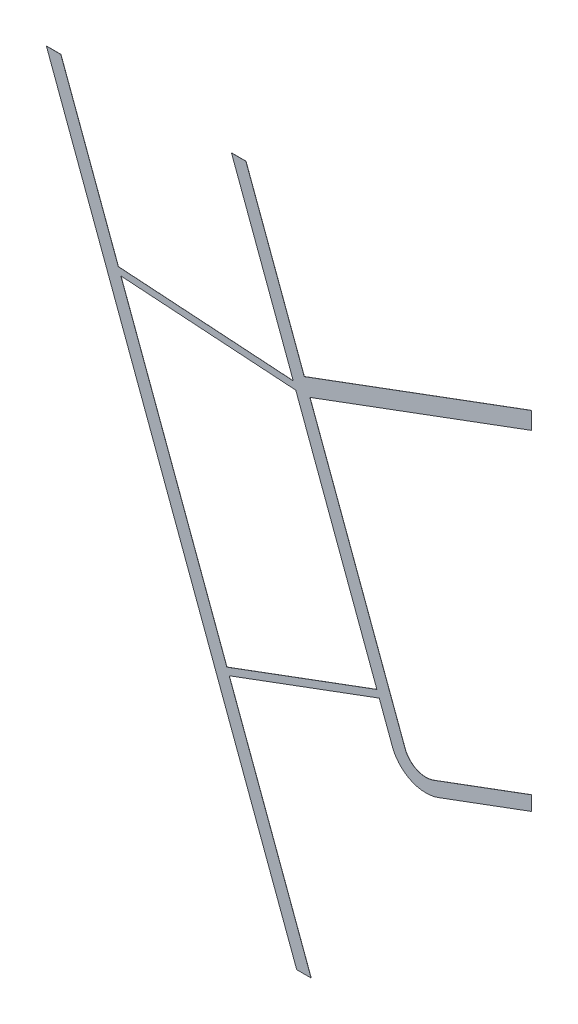
ISO-10303-21;
HEADER;
FILE_DESCRIPTION(('STEP AP214'),'2;1');
FILE_NAME('part.step','',(''),(''),'','','');
FILE_SCHEMA(('AUTOMOTIVE_DESIGN { 1 0 10303 214 1 1 1 1 }'));
ENDSEC;
DATA;
#1=APPLICATION_CONTEXT('core data for automotive mechanical design processes');
#2=APPLICATION_PROTOCOL_DEFINITION('international standard','automotive_design',2000,#1);
#3=PRODUCT_CONTEXT('',#1,'mechanical');
#4=PRODUCT('Part','Part','',(#3));
#5=PRODUCT_RELATED_PRODUCT_CATEGORY('part','',(#4));
#6=PRODUCT_DEFINITION_FORMATION('','',#4);
#7=PRODUCT_DEFINITION_CONTEXT('part definition',#1,'design');
#8=PRODUCT_DEFINITION('design','',#6,#7);
#9=PRODUCT_DEFINITION_SHAPE('','',#8);
#10=(LENGTH_UNIT() NAMED_UNIT(*) SI_UNIT(.MILLI.,.METRE.));
#11=(NAMED_UNIT(*) PLANE_ANGLE_UNIT() SI_UNIT($,.RADIAN.));
#12=(NAMED_UNIT(*) SI_UNIT($,.STERADIAN.) SOLID_ANGLE_UNIT());
#13=UNCERTAINTY_MEASURE_WITH_UNIT(LENGTH_MEASURE(1.E-05),#10,'distance_accuracy_value','');
#14=(GEOMETRIC_REPRESENTATION_CONTEXT(3) GLOBAL_UNCERTAINTY_ASSIGNED_CONTEXT((#13)) GLOBAL_UNIT_ASSIGNED_CONTEXT((#10,
#11,#12)) REPRESENTATION_CONTEXT('',''));
#15=CARTESIAN_POINT('',(0.,0.,0.));
#16=DIRECTION('',(0.,0.,1.));
#17=DIRECTION('',(1.,0.,0.));
#18=AXIS2_PLACEMENT_3D('',#15,#16,#17);
#19=CARTESIAN_POINT('',(105886.022376509,39280.2986235443,0.));
#20=DIRECTION('',(-0.937423422533661,-0.347753850294752,0.0174524064372835));
#21=DIRECTION('',(0.347806822958529,-0.937566218409929,0.));
#22=AXIS2_PLACEMENT_3D('',#19,#20,#21);
#23=PLANE('',#22);
#24=DIRECTION('',(-0.347806822958529,0.937566218409929,0.));
#25=VECTOR('',#24,1.);
#26=CARTESIAN_POINT('',(105886.022376509,39280.2986235443,0.));
#27=LINE('',#26,#25);
#28=CARTESIAN_POINT('',(135462.997839648,-40448.9395814397,0.));
#29=VERTEX_POINT('',#28);
#30=CARTESIAN_POINT('',(75362.2991137215,121561.639592795,0.));
#31=VERTEX_POINT('',#30);
#32=EDGE_CURVE('E272',#29,#31,#27,.T.);
#33=ORIENTED_EDGE('',*,*,#32,.F.);
#34=DIRECTION('',(-0.0224294371497834,0.0102911535157828,-0.999695459881888));
#35=VECTOR('',#34,1.);
#36=CARTESIAN_POINT('',(135429.714781213,-40433.6685310986,-1483.44883498776));
#37=LINE('',#36,#35);
#38=CARTESIAN_POINT('',(135465.241466638,-40449.9690102937,100.));
#39=VERTEX_POINT('',#38);
#40=EDGE_CURVE('E11',#39,#29,#37,.T.);
#41=ORIENTED_EDGE('',*,*,#40,.F.);
#42=DIRECTION('',(-0.347806822958529,0.937566218409929,0.));
#43=VECTOR('',#42,1.);
#44=CARTESIAN_POINT('',(105887.65890443,39280.905722612,100.));
#45=LINE('',#44,#43);
#46=CARTESIAN_POINT('',(75363.5422398978,121563.307166133,100.));
#47=VERTEX_POINT('',#46);
#48=EDGE_CURVE('E371',#39,#47,#45,.T.);
#49=ORIENTED_EDGE('',*,*,#48,.T.);
#50=DIRECTION('',(-0.012428573650737,-0.0166721274536834,-0.999783761982148));
#51=VECTOR('',#50,1.);
#52=CARTESIAN_POINT('',(75352.8503053564,121548.964627688,-760.084418298319));
#53=LINE('',#52,#51);
#54=EDGE_CURVE('E51',#47,#31,#53,.T.);
#55=ORIENTED_EDGE('',*,*,#54,.T.);
#56=EDGE_LOOP('',(#33,#41,#49,#55));
#57=FACE_BOUND('',#56,.T.);
#58=ADVANCED_FACE('F34',(#57),#23,.T.);
#59=CARTESIAN_POINT('',(29576.9754631399,-79729.2382049841,0.));
#60=DIRECTION('',(-0.347753850294752,0.937423422533661,0.0174524064372835));
#61=DIRECTION('',(-0.937566218409929,-0.347806822958529,0.));
#62=AXIS2_PLACEMENT_3D('',#59,#60,#61);
#63=PLANE('',#62);
#64=DIRECTION('',(0.937566218409929,0.347806822958529,0.));
#65=VECTOR('',#64,1.);
#66=CARTESIAN_POINT('',(29576.9754631399,-79729.2382049841,0.));
#67=LINE('',#66,#65);
#68=CARTESIAN_POINT('',(24270.0392753806,-81697.9403391529,0.));
#69=VERTEX_POINT('',#68);
#70=EDGE_CURVE('E275',#69,#29,#67,.T.);
#71=ORIENTED_EDGE('',*,*,#70,.F.);
#72=DIRECTION('',(-0.0102911535157828,-0.0224294371497834,0.999695459881888));
#73=VECTOR('',#72,1.);
#74=CARTESIAN_POINT('',(24285.3103257218,-81664.657280717,-1483.44883498776));
#75=LINE('',#74,#73);
#76=CARTESIAN_POINT('',(24269.0098465267,-81700.1839661423,100.));
#77=VERTEX_POINT('',#76);
#78=EDGE_CURVE('E43',#77,#69,#75,.F.);
#79=ORIENTED_EDGE('',*,*,#78,.F.);
#80=DIRECTION('',(0.937566218409929,0.347806822958529,0.));
#81=VECTOR('',#80,1.);
#82=CARTESIAN_POINT('',(29577.5825622076,-79730.8747329058,100.));
#83=LINE('',#82,#81);
#84=EDGE_CURVE('E378',#77,#39,#83,.T.);
#85=ORIENTED_EDGE('',*,*,#84,.T.);
#86=ORIENTED_EDGE('',*,*,#40,.T.);
#87=EDGE_LOOP('',(#71,#79,#85,#86));
#88=FACE_BOUND('',#87,.T.);
#89=ADVANCED_FACE('F36',(#88),#63,.T.);
#90=CARTESIAN_POINT('',(-5306.93618775923,-1968.70213416878,0.));
#91=DIRECTION('',(0.937423422533661,0.347753850294752,0.0174524064372835));
#92=DIRECTION('',(-0.347806822958529,0.937566218409929,0.));
#93=AXIS2_PLACEMENT_3D('',#90,#91,#92);
#94=PLANE('',#93);
#95=DIRECTION('',(-0.347806822958529,0.937566218409929,0.));
#96=VECTOR('',#95,1.);
#97=CARTESIAN_POINT('',(-5306.93618775923,-1968.70213416878,0.));
#98=LINE('',#97,#96);
#99=CARTESIAN_POINT('',(-54293.7378771381,130082.67633285,0.));
#100=VERTEX_POINT('',#99);
#101=EDGE_CURVE('E278',#69,#100,#98,.T.);
#102=ORIENTED_EDGE('',*,*,#101,.T.);
#103=DIRECTION('',(-0.0257208088566021,0.0191740956946787,0.999485264546733));
#104=VECTOR('',#103,1.);
#105=CARTESIAN_POINT('',(-54250.3143081011,130050.305357553,-1687.39706548793));
#106=LINE('',#105,#104);
#107=CARTESIAN_POINT('',(-54296.3112826469,130084.594729886,100.));
#108=VERTEX_POINT('',#107);
#109=EDGE_CURVE('E374',#108,#100,#106,.F.);
#110=ORIENTED_EDGE('',*,*,#109,.F.);
#111=DIRECTION('',(0.347806822958529,-0.937566218409929,0.));
#112=VECTOR('',#111,1.);
#113=CARTESIAN_POINT('',(-5308.57271568091,-1969.30923323651,100.));
#114=LINE('',#113,#112);
#115=EDGE_CURVE('E59',#77,#108,#114,.F.);
#116=ORIENTED_EDGE('',*,*,#115,.F.);
#117=ORIENTED_EDGE('',*,*,#78,.T.);
#118=EDGE_LOOP('',(#102,#110,#116,#117));
#119=FACE_BOUND('',#118,.T.);
#120=ADVANCED_FACE('F389',(#119),#94,.T.);
#121=CARTESIAN_POINT('',(171789.188269937,-62216.0640065166,0.));
#122=DIRECTION('',(0.,0.,1.));
#123=DIRECTION('',(1.,0.,0.));
#124=AXIS2_PLACEMENT_3D('',#121,#122,#123);
#125=CONICAL_SURFACE('',#124,16487.4545997351,0.0174532925199433);
#126=CARTESIAN_POINT('',(171789.188269937,-62216.0640065166,0.));
#127=DIRECTION('',(0.,0.,1.));
#128=DIRECTION('',(1.,0.,0.));
#129=AXIS2_PLACEMENT_3D('',#126,#127,#128);
#130=CIRCLE('',#129,16487.4545997351);
#131=CARTESIAN_POINT('',(156331.107809658,-67950.5132095235,0.));
#132=VERTEX_POINT('',#131);
#133=CARTESIAN_POINT('',(177523.637472943,-77674.1444667957,0.));
#134=VERTEX_POINT('',#133);
#135=EDGE_CURVE('E217',#132,#134,#130,.T.);
#136=ORIENTED_EDGE('',*,*,#135,.F.);
#137=DIRECTION('',(0.016362786705557,0.00607006603593257,-0.999847695156391));
#138=VECTOR('',#137,1.);
#139=CARTESIAN_POINT('',(156331.107809658,-67950.5132095235,-1.23969035357567E-13));
#140=LINE('',#139,#138);
#141=CARTESIAN_POINT('',(156329.471281736,-67951.1203085913,100.));
#142=VERTEX_POINT('',#141);
#143=EDGE_CURVE('E198',#142,#132,#140,.T.);
#144=ORIENTED_EDGE('',*,*,#143,.F.);
#145=CARTESIAN_POINT('',(171789.188269937,-62216.0640065166,100.));
#146=DIRECTION('',(0.,0.,1.));
#147=DIRECTION('',(1.,0.,0.));
#148=AXIS2_PLACEMENT_3D('',#145,#146,#147);
#149=CIRCLE('',#148,16489.200106228);
#150=CARTESIAN_POINT('',(177524.244572011,-77675.7809947174,100.));
#151=VERTEX_POINT('',#150);
#152=EDGE_CURVE('E283',#142,#151,#149,.T.);
#153=ORIENTED_EDGE('',*,*,#152,.T.);
#154=DIRECTION('',(-0.00607006603593255,0.016362786705557,-0.999847695156391));
#155=VECTOR('',#154,1.);
#156=CARTESIAN_POINT('',(177523.637472943,-77674.1444667957,-1.85981878977343E-13));
#157=LINE('',#156,#155);
#158=EDGE_CURVE('E223',#151,#134,#157,.T.);
#159=ORIENTED_EDGE('',*,*,#158,.T.);
#160=EDGE_LOOP('',(#136,#144,#153,#159));
#161=FACE_BOUND('',#160,.T.);
#162=ADVANCED_FACE('F222',(#161),#125,.F.);
#163=CARTESIAN_POINT('',(115261.684560608,42758.3668531296,0.));
#164=DIRECTION('',(0.937423422533661,0.347753850294752,0.0174524064372835));
#165=DIRECTION('',(-0.347806822958529,0.937566218409929,0.));
#166=AXIS2_PLACEMENT_3D('',#163,#164,#165);
#167=PLANE('',#166);
#168=DIRECTION('',(-0.347806822958529,0.937566218409929,0.));
#169=VECTOR('',#168,1.);
#170=CARTESIAN_POINT('',(115261.684560608,42758.3668531296,0.));
#171=LINE('',#170,#169);
#172=CARTESIAN_POINT('',(85803.0786017647,122168.522046532,0.));
#173=VERTEX_POINT('',#172);
#174=EDGE_CURVE('E202',#132,#173,#171,.T.);
#175=ORIENTED_EDGE('',*,*,#174,.T.);
#176=DIRECTION('',(0.0224294371497834,-0.0102911535157828,-0.999695459881888));
#177=VECTOR('',#176,1.);
#178=CARTESIAN_POINT('',(85836.2284586453,122153.312112198,-1477.51194994468));
#179=LINE('',#178,#177);
#180=CARTESIAN_POINT('',(85800.8349747753,122169.551475386,100.));
#181=VERTEX_POINT('',#180);
#182=EDGE_CURVE('E209',#181,#173,#179,.T.);
#183=ORIENTED_EDGE('',*,*,#182,.F.);
#184=DIRECTION('',(0.347806822958529,-0.937566218409929,0.));
#185=VECTOR('',#184,1.);
#186=CARTESIAN_POINT('',(115260.048032686,42757.7597540619,100.));
#187=LINE('',#186,#185);
#188=EDGE_CURVE('E204',#142,#181,#187,.F.);
#189=ORIENTED_EDGE('',*,*,#188,.F.);
#190=ORIENTED_EDGE('',*,*,#143,.T.);
#191=EDGE_LOOP('',(#175,#183,#189,#190));
#192=FACE_BOUND('',#191,.T.);
#193=ADVANCED_FACE('F200',(#192),#167,.T.);
#194=CARTESIAN_POINT('',(-29458.6059588433,79410.1551934018,0.));
#195=DIRECTION('',(0.347753850294754,-0.937423422533661,0.0174524064372835));
#196=DIRECTION('',(0.937566218409928,0.347806822958531,0.));
#197=AXIS2_PLACEMENT_3D('',#194,#195,#196);
#198=PLANE('',#197);
#199=DIRECTION('',(0.937566218409928,0.347806822958531,0.));
#200=VECTOR('',#199,1.);
#201=CARTESIAN_POINT('',(-29458.6059588433,79410.1551934018,0.));
#202=LINE('',#201,#200);
#203=CARTESIAN_POINT('',(250000.,183080.283210395,0.));
#204=VERTEX_POINT('',#203);
#205=EDGE_CURVE('E220',#173,#204,#202,.T.);
#206=ORIENTED_EDGE('',*,*,#205,.T.);
#207=DIRECTION('',(0.0174511204503486,-0.0121394110260807,-0.999774021014233));
#208=VECTOR('',#207,1.);
#209=CARTESIAN_POINT('',(250038.784884997,183053.303529524,-2221.98457334734));
#210=LINE('',#209,#208);
#211=CARTESIAN_POINT('',(249998.254493507,183081.497425885,100.));
#212=VERTEX_POINT('',#211);
#213=EDGE_CURVE('E323',#212,#204,#210,.T.);
#214=ORIENTED_EDGE('',*,*,#213,.F.);
#215=DIRECTION('',(-0.937566218409928,-0.347806822958531,0.));
#216=VECTOR('',#215,1.);
#217=CARTESIAN_POINT('',(-29459.2130579111,79411.7917213235,100.));
#218=LINE('',#217,#216);
#219=EDGE_CURVE('E329',#181,#212,#218,.F.);
#220=ORIENTED_EDGE('',*,*,#219,.F.);
#221=ORIENTED_EDGE('',*,*,#182,.T.);
#222=EDGE_LOOP('',(#206,#214,#220,#221));
#223=FACE_BOUND('',#222,.T.);
#224=ADVANCED_FACE('F408',(#223),#198,.T.);
#225=CARTESIAN_POINT('',(249999.999999999,-1.1103014429754E-09,0.));
#226=DIRECTION('',(0.999847695156391,0.,0.0174524064372835));
#227=DIRECTION('',(0.0174524064372835,0.,-0.999847695156391));
#228=AXIS2_PLACEMENT_3D('',#225,#226,#227);
#229=PLANE('',#228);
#230=DIRECTION('',(0.,1.,0.));
#231=VECTOR('',#230,1.);
#232=CARTESIAN_POINT('',(249999.999999999,-1.1103014429754E-09,0.));
#233=LINE('',#232,#231);
#234=CARTESIAN_POINT('',(250000.,195879.379172226,0.));
#235=VERTEX_POINT('',#234);
#236=EDGE_CURVE('E227',#204,#235,#233,.T.);
#237=ORIENTED_EDGE('',*,*,#236,.T.);
#238=DIRECTION('',(-0.0174469163102588,-0.0250809728217744,0.999533165989792));
#239=VECTOR('',#238,1.);
#240=CARTESIAN_POINT('',(249914.285997716,195756.160230638,4910.5519020519));
#241=LINE('',#240,#239);
#242=CARTESIAN_POINT('',(249998.254493507,195876.869903532,100.));
#243=VERTEX_POINT('',#242);
#244=EDGE_CURVE('E321',#243,#235,#241,.F.);
#245=ORIENTED_EDGE('',*,*,#244,.F.);
#246=DIRECTION('',(0.,-1.,0.));
#247=VECTOR('',#246,1.);
#248=CARTESIAN_POINT('',(249998.254493506,-1.11029369082189E-09,100.));
#249=LINE('',#248,#247);
#250=EDGE_CURVE('E331',#212,#243,#249,.F.);
#251=ORIENTED_EDGE('',*,*,#250,.F.);
#252=ORIENTED_EDGE('',*,*,#213,.T.);
#253=EDGE_LOOP('',(#237,#245,#251,#252));
#254=FACE_BOUND('',#253,.T.);
#255=ADVANCED_FACE('F474',(#254),#229,.T.);
#256=CARTESIAN_POINT('',(-33632.2878343457,90660.9498143214,0.));
#257=DIRECTION('',(-0.347753850294752,0.937423422533661,0.0174524064372835));
#258=DIRECTION('',(-0.937566218409929,-0.347806822958529,0.));
#259=AXIS2_PLACEMENT_3D('',#256,#257,#258);
#260=PLANE('',#259);
#261=DIRECTION('',(0.937566218409929,0.347806822958529,0.));
#262=VECTOR('',#261,1.);
#263=CARTESIAN_POINT('',(-33632.2878343457,90660.9498143214,0.));
#264=LINE('',#263,#262);
#265=CARTESIAN_POINT('',(81629.3967262622,133419.316667451,0.));
#266=VERTEX_POINT('',#265);
#267=EDGE_CURVE('E230',#266,#235,#264,.T.);
#268=ORIENTED_EDGE('',*,*,#267,.F.);
#269=DIRECTION('',(-0.0102911535157828,-0.0224294371497834,0.999695459881888));
#270=VECTOR('',#269,1.);
#271=CARTESIAN_POINT('',(81612.0318553596,133381.470153945,1686.84517008883));
#272=LINE('',#271,#270);
#273=CARTESIAN_POINT('',(81628.3672974083,133417.073040462,100.));
#274=VERTEX_POINT('',#273);
#275=EDGE_CURVE('E319',#274,#266,#272,.F.);
#276=ORIENTED_EDGE('',*,*,#275,.F.);
#277=DIRECTION('',(0.937566218409929,0.347806822958529,0.));
#278=VECTOR('',#277,1.);
#279=CARTESIAN_POINT('',(-33631.680735278,90659.3132863997,100.));
#280=LINE('',#279,#278);
#281=EDGE_CURVE('E333',#274,#243,#280,.T.);
#282=ORIENTED_EDGE('',*,*,#281,.T.);
#283=ORIENTED_EDGE('',*,*,#244,.T.);
#284=EDGE_LOOP('',(#268,#276,#282,#283));
#285=FACE_BOUND('',#284,.T.);
#286=ADVANCED_FACE('F470',(#285),#260,.T.);
#287=CARTESIAN_POINT('',(115261.684560608,42758.3668531296,0.));
#288=DIRECTION('',(0.937423422533661,0.347753850294752,0.0174524064372835));
#289=DIRECTION('',(-0.347806822958529,0.937566218409929,0.));
#290=AXIS2_PLACEMENT_3D('',#287,#288,#289);
#291=PLANE('',#290);
#292=DIRECTION('',(-0.347806822958529,0.937566218409929,0.));
#293=VECTOR('',#292,1.);
#294=CARTESIAN_POINT('',(115261.684560608,42758.3668531296,0.));
#295=LINE('',#294,#293);
#296=CARTESIAN_POINT('',(38381.7238770899,250000.,0.));
#297=VERTEX_POINT('',#296);
#298=EDGE_CURVE('E233',#266,#297,#295,.T.);
#299=ORIENTED_EDGE('',*,*,#298,.T.);
#300=DIRECTION('',(-0.0121394110260807,-0.0174511204503486,0.999774021014233));
#301=VECTOR('',#300,1.);
#302=CARTESIAN_POINT('',(38349.1499374002,249953.173037485,2682.71488575004));
#303=LINE('',#302,#301);
#304=CARTESIAN_POINT('',(38380.5096616002,249998.254493507,100.));
#305=VERTEX_POINT('',#304);
#306=EDGE_CURVE('E317',#305,#297,#303,.F.);
#307=ORIENTED_EDGE('',*,*,#306,.F.);
#308=DIRECTION('',(0.347806822958529,-0.937566218409929,0.));
#309=VECTOR('',#308,1.);
#310=CARTESIAN_POINT('',(115260.048032686,42757.7597540619,100.));
#311=LINE('',#310,#309);
#312=EDGE_CURVE('E336',#274,#305,#311,.F.);
#313=ORIENTED_EDGE('',*,*,#312,.F.);
#314=ORIENTED_EDGE('',*,*,#275,.T.);
#315=EDGE_LOOP('',(#299,#307,#313,#314));
#316=FACE_BOUND('',#315,.T.);
#317=ADVANCED_FACE('F466',(#316),#291,.T.);
#318=CARTESIAN_POINT('',(0.,250000.,0.));
#319=DIRECTION('',(0.,0.999847695156391,0.0174524064372835));
#320=DIRECTION('',(0.,-0.0174524064372835,0.999847695156391));
#321=AXIS2_PLACEMENT_3D('',#318,#319,#320);
#322=PLANE('',#321);
#323=DIRECTION('',(1.,0.,0.));
#324=VECTOR('',#323,1.);
#325=CARTESIAN_POINT('',(0.,250000.,0.));
#326=LINE('',#325,#324);
#327=CARTESIAN_POINT('',(27715.8105755638,250000.,0.));
#328=VERTEX_POINT('',#327);
#329=EDGE_CURVE('E236',#328,#297,#326,.T.);
#330=ORIENTED_EDGE('',*,*,#329,.F.);
#331=DIRECTION('',(-0.0250809728217743,0.0174469163102587,-0.999533165989792));
#332=VECTOR('',#331,1.);
#333=CARTESIAN_POINT('',(27857.1918676827,249901.65183827,5634.36241199722));
#334=LINE('',#333,#332);
#335=CARTESIAN_POINT('',(27718.319844258,249998.254493507,100.));
#336=VERTEX_POINT('',#335);
#337=EDGE_CURVE('E315',#336,#328,#334,.T.);
#338=ORIENTED_EDGE('',*,*,#337,.F.);
#339=DIRECTION('',(1.,0.,0.));
#340=VECTOR('',#339,1.);
#341=CARTESIAN_POINT('',(0.,249998.254493507,100.));
#342=LINE('',#341,#340);
#343=EDGE_CURVE('E338',#336,#305,#342,.T.);
#344=ORIENTED_EDGE('',*,*,#343,.T.);
#345=ORIENTED_EDGE('',*,*,#306,.T.);
#346=EDGE_LOOP('',(#330,#338,#344,#345));
#347=FACE_BOUND('',#346,.T.);
#348=ADVANCED_FACE('F462',(#347),#322,.T.);
#349=CARTESIAN_POINT('',(105886.022376509,39280.2986235443,0.));
#350=DIRECTION('',(-0.937423422533661,-0.347753850294752,0.0174524064372835));
#351=DIRECTION('',(0.347806822958529,-0.937566218409929,0.));
#352=AXIS2_PLACEMENT_3D('',#349,#350,#351);
#353=PLANE('',#352);
#354=DIRECTION('',(-0.347806822958529,0.937566218409929,0.));
#355=VECTOR('',#354,1.);
#356=CARTESIAN_POINT('',(105886.022376509,39280.2986235443,0.));
#357=LINE('',#356,#355);
#358=CARTESIAN_POINT('',(73507.4604040441,126561.639592795,0.));
#359=VERTEX_POINT('',#358);
#360=EDGE_CURVE('E239',#359,#328,#357,.T.);
#361=ORIENTED_EDGE('',*,*,#360,.F.);
#362=DIRECTION('',(0.0257208088566021,-0.0191740956946787,0.999485264546733));
#363=VECTOR('',#362,1.);
#364=CARTESIAN_POINT('',(73462.4151057434,126595.219518878,-1750.41586520992));
#365=LINE('',#364,#363);
#366=CARTESIAN_POINT('',(73510.0338095528,126559.721195758,100.));
#367=VERTEX_POINT('',#366);
#368=EDGE_CURVE('E313',#367,#359,#365,.F.);
#369=ORIENTED_EDGE('',*,*,#368,.F.);
#370=DIRECTION('',(-0.347806822958529,0.937566218409929,0.));
#371=VECTOR('',#370,1.);
#372=CARTESIAN_POINT('',(105887.65890443,39280.9057226121,100.));
#373=LINE('',#372,#371);
#374=EDGE_CURVE('E341',#367,#336,#373,.T.);
#375=ORIENTED_EDGE('',*,*,#374,.T.);
#376=ORIENTED_EDGE('',*,*,#337,.T.);
#377=EDGE_LOOP('',(#361,#369,#375,#376));
#378=FACE_BOUND('',#377,.T.);
#379=ADVANCED_FACE('F458',(#378),#353,.T.);
#380=CARTESIAN_POINT('',(8598.02623537787,130827.508627234,0.));
#381=DIRECTION('',(0.0655688656533903,0.997695413122901,0.0174524064372835));
#382=DIRECTION('',(-0.997847390113597,0.0655788536304365,0.));
#383=AXIS2_PLACEMENT_3D('',#380,#381,#382);
#384=PLANE('',#383);
#385=DIRECTION('',(-0.997847390113597,0.0655788536304366,0.));
#386=VECTOR('',#385,1.);
#387=CARTESIAN_POINT('',(8598.02623537787,130827.508627234,0.));
#388=LINE('',#387,#386);
#389=CARTESIAN_POINT('',(-56148.5765868156,135082.67633285,0.));
#390=VERTEX_POINT('',#389);
#391=EDGE_CURVE('E242',#359,#390,#388,.T.);
#392=ORIENTED_EDGE('',*,*,#391,.T.);
#393=DIRECTION('',(0.012428573650737,0.0166721274536834,-0.999783761982148));
#394=VECTOR('',#393,1.);
#395=CARTESIAN_POINT('',(-56139.4569316931,135094.909760177,-733.606555548322));
#396=LINE('',#395,#394);
#397=CARTESIAN_POINT('',(-56149.8197129918,135081.008759512,100.));
#398=VERTEX_POINT('',#397);
#399=EDGE_CURVE('E310',#398,#390,#396,.T.);
#400=ORIENTED_EDGE('',*,*,#399,.F.);
#401=DIRECTION('',(0.997847390113597,-0.0655788536304365,0.));
#402=VECTOR('',#401,1.);
#403=CARTESIAN_POINT('',(8597.91176706307,130825.766878136,100.));
#404=LINE('',#403,#402);
#405=EDGE_CURVE('E344',#367,#398,#404,.F.);
#406=ORIENTED_EDGE('',*,*,#405,.F.);
#407=ORIENTED_EDGE('',*,*,#368,.T.);
#408=EDGE_LOOP('',(#392,#400,#406,#407));
#409=FACE_BOUND('',#408,.T.);
#410=ADVANCED_FACE('F454',(#409),#384,.T.);
#411=CARTESIAN_POINT('',(-5306.93618775918,-1968.70213416877,0.));
#412=DIRECTION('',(0.937423422533661,0.347753850294752,0.0174524064372835));
#413=DIRECTION('',(-0.347806822958529,0.937566218409929,0.));
#414=AXIS2_PLACEMENT_3D('',#411,#412,#413);
#415=PLANE('',#414);
#416=DIRECTION('',(-0.347806822958529,0.937566218409929,0.));
#417=VECTOR('',#416,1.);
#418=CARTESIAN_POINT('',(-5306.93618775918,-1968.70213416877,0.));
#419=LINE('',#418,#417);
#420=CARTESIAN_POINT('',(-98779.1966568882,250000.,0.));
#421=VERTEX_POINT('',#420);
#422=EDGE_CURVE('E244',#390,#421,#419,.T.);
#423=ORIENTED_EDGE('',*,*,#422,.T.);
#424=DIRECTION('',(-0.0121394110260807,-0.0174511204503486,0.999774021014233));
#425=VECTOR('',#424,1.);
#426=CARTESIAN_POINT('',(-98818.8007324902,249943.066801827,3261.70073886363));
#427=LINE('',#426,#425);
#428=CARTESIAN_POINT('',(-98780.410872378,249998.254493507,100.));
#429=VERTEX_POINT('',#428);
#430=EDGE_CURVE('E308',#429,#421,#427,.F.);
#431=ORIENTED_EDGE('',*,*,#430,.F.);
#432=DIRECTION('',(0.347806822958529,-0.937566218409929,0.));
#433=VECTOR('',#432,1.);
#434=CARTESIAN_POINT('',(-5308.57271568087,-1969.30923323649,100.));
#435=LINE('',#434,#433);
#436=EDGE_CURVE('E346',#398,#429,#435,.F.);
#437=ORIENTED_EDGE('',*,*,#436,.F.);
#438=ORIENTED_EDGE('',*,*,#399,.T.);
#439=EDGE_LOOP('',(#423,#431,#437,#438));
#440=FACE_BOUND('',#439,.T.);
#441=ADVANCED_FACE('F450',(#440),#415,.T.);
#442=CARTESIAN_POINT('',(0.,250000.,0.));
#443=DIRECTION('',(0.,0.999847695156391,0.0174524064372835));
#444=DIRECTION('',(0.,-0.0174524064372835,0.999847695156391));
#445=AXIS2_PLACEMENT_3D('',#442,#443,#444);
#446=PLANE('',#445);
#447=DIRECTION('',(1.,0.,0.));
#448=VECTOR('',#447,1.);
#449=CARTESIAN_POINT('',(0.,250000.,0.));
#450=LINE('',#449,#448);
#451=CARTESIAN_POINT('',(-109445.109958414,250000.,0.));
#452=VERTEX_POINT('',#451);
#453=EDGE_CURVE('E247',#452,#421,#450,.T.);
#454=ORIENTED_EDGE('',*,*,#453,.F.);
#455=DIRECTION('',(-0.0250809728217743,0.0174469163102587,-0.999533165989792));
#456=VECTOR('',#455,1.);
#457=CARTESIAN_POINT('',(-109273.719271043,249880.776595064,6830.30429429241));
#458=LINE('',#457,#456);
#459=CARTESIAN_POINT('',(-109442.60068972,249998.254493507,100.));
#460=VERTEX_POINT('',#459);
#461=EDGE_CURVE('E306',#460,#452,#458,.T.);
#462=ORIENTED_EDGE('',*,*,#461,.F.);
#463=DIRECTION('',(1.,0.,0.));
#464=VECTOR('',#463,1.);
#465=CARTESIAN_POINT('',(0.,249998.254493507,100.));
#466=LINE('',#465,#464);
#467=EDGE_CURVE('E348',#460,#429,#466,.T.);
#468=ORIENTED_EDGE('',*,*,#467,.T.);
#469=ORIENTED_EDGE('',*,*,#430,.T.);
#470=EDGE_LOOP('',(#454,#462,#468,#469));
#471=FACE_BOUND('',#470,.T.);
#472=ADVANCED_FACE('F446',(#471),#446,.T.);
#473=CARTESIAN_POINT('',(-14682.5983718585,-5446.77036375407,0.));
#474=DIRECTION('',(-0.937423422533661,-0.347753850294752,0.0174524064372835));
#475=DIRECTION('',(0.347806822958529,-0.937566218409929,0.));
#476=AXIS2_PLACEMENT_3D('',#473,#474,#475);
#477=PLANE('',#476);
#478=DIRECTION('',(-0.347806822958529,0.937566218409929,0.));
#479=VECTOR('',#478,1.);
#480=CARTESIAN_POINT('',(-14682.5983718585,-5446.77036375407,0.));
#481=LINE('',#480,#479);
#482=CARTESIAN_POINT('',(76038.7610093313,-250000.,0.));
#483=VERTEX_POINT('',#482);
#484=EDGE_CURVE('E250',#483,#452,#481,.T.);
#485=ORIENTED_EDGE('',*,*,#484,.F.);
#486=DIRECTION('',(0.0121394110260807,0.0174511204503487,0.999774021014233));
#487=VECTOR('',#486,1.);
#488=CARTESIAN_POINT('',(76077.199531708,-249944.74235344,3165.70845124762));
#489=LINE('',#488,#487);
#490=CARTESIAN_POINT('',(76039.9752248211,-249998.254493507,100.));
#491=VERTEX_POINT('',#490);
#492=EDGE_CURVE('E304',#491,#483,#489,.F.);
#493=ORIENTED_EDGE('',*,*,#492,.F.);
#494=DIRECTION('',(-0.347806822958529,0.937566218409929,0.));
#495=VECTOR('',#494,1.);
#496=CARTESIAN_POINT('',(-14680.9618439368,-5446.16326468635,100.));
#497=LINE('',#496,#495);
#498=EDGE_CURVE('E351',#491,#460,#497,.T.);
#499=ORIENTED_EDGE('',*,*,#498,.T.);
#500=ORIENTED_EDGE('',*,*,#461,.T.);
#501=EDGE_LOOP('',(#485,#493,#499,#500));
#502=FACE_BOUND('',#501,.T.);
#503=ADVANCED_FACE('F442',(#502),#477,.T.);
#504=CARTESIAN_POINT('',(6.66180865785242E-10,-250000.,0.));
#505=DIRECTION('',(0.,-0.999847695156391,0.0174524064372835));
#506=DIRECTION('',(0.,-0.0174524064372835,-0.999847695156391));
#507=AXIS2_PLACEMENT_3D('',#504,#505,#506);
#508=PLANE('',#507);
#509=DIRECTION('',(1.,0.,0.));
#510=VECTOR('',#509,1.);
#511=CARTESIAN_POINT('',(6.66180865785242E-10,-250000.,0.));
#512=LINE('',#511,#510);
#513=CARTESIAN_POINT('',(86704.6743108574,-250000.,0.));
#514=VERTEX_POINT('',#513);
#515=EDGE_CURVE('E253',#483,#514,#512,.T.);
#516=ORIENTED_EDGE('',*,*,#515,.T.);
#517=DIRECTION('',(0.0250809728217743,-0.0174469163102587,-0.999533165989792));
#518=VECTOR('',#517,1.);
#519=CARTESIAN_POINT('',(86538.2589963466,-249884.237581786,6632.02449778275));
#520=LINE('',#519,#518);
#521=CARTESIAN_POINT('',(86702.1650421633,-249998.254493507,100.));
#522=VERTEX_POINT('',#521);
#523=EDGE_CURVE('E301',#522,#514,#520,.T.);
#524=ORIENTED_EDGE('',*,*,#523,.F.);
#525=DIRECTION('',(-1.,0.,0.));
#526=VECTOR('',#525,1.);
#527=CARTESIAN_POINT('',(6.66176214493136E-10,-249998.254493507,100.));
#528=LINE('',#527,#526);
#529=EDGE_CURVE('E354',#491,#522,#528,.F.);
#530=ORIENTED_EDGE('',*,*,#529,.F.);
#531=ORIENTED_EDGE('',*,*,#492,.T.);
#532=EDGE_LOOP('',(#516,#524,#530,#531));
#533=FACE_BOUND('',#532,.T.);
#534=ADVANCED_FACE('F438',(#533),#508,.T.);
#535=CARTESIAN_POINT('',(-5306.9361877592,-1968.70213416878,0.));
#536=DIRECTION('',(0.937423422533661,0.347753850294752,0.0174524064372835));
#537=DIRECTION('',(-0.347806822958529,0.937566218409929,0.));
#538=AXIS2_PLACEMENT_3D('',#535,#536,#537);
#539=PLANE('',#538);
#540=DIRECTION('',(-0.347806822958529,0.937566218409929,0.));
#541=VECTOR('',#540,1.);
#542=CARTESIAN_POINT('',(-5306.9361877592,-1968.70213416878,0.));
#543=LINE('',#542,#541);
#544=CARTESIAN_POINT('',(26009.0733901733,-86385.7714312025,0.));
#545=VERTEX_POINT('',#544);
#546=EDGE_CURVE('E255',#514,#545,#543,.T.);
#547=ORIENTED_EDGE('',*,*,#546,.T.);
#548=DIRECTION('',(0.0224294371497834,-0.0102911535157828,-0.999695459881887));
#549=VECTOR('',#548,1.);
#550=CARTESIAN_POINT('',(25973.8333914771,-86369.6024906243,1570.67101004782));
#551=LINE('',#550,#549);
#552=CARTESIAN_POINT('',(26006.8297631839,-86384.7420023485,100.));
#553=VERTEX_POINT('',#552);
#554=EDGE_CURVE('E298',#553,#545,#551,.T.);
#555=ORIENTED_EDGE('',*,*,#554,.F.);
#556=DIRECTION('',(0.347806822958529,-0.937566218409929,0.));
#557=VECTOR('',#556,1.);
#558=CARTESIAN_POINT('',(-5308.57271568089,-1969.3092332365,100.));
#559=LINE('',#558,#557);
#560=EDGE_CURVE('E356',#522,#553,#559,.F.);
#561=ORIENTED_EDGE('',*,*,#560,.F.);
#562=ORIENTED_EDGE('',*,*,#523,.T.);
#563=EDGE_LOOP('',(#547,#555,#561,#562));
#564=FACE_BOUND('',#563,.T.);
#565=ADVANCED_FACE('F434',(#564),#539,.T.);
#566=CARTESIAN_POINT('',(31316.0095779325,-84417.0692970337,0.));
#567=DIRECTION('',(0.347753850294752,-0.937423422533661,0.0174524064372835));
#568=DIRECTION('',(0.937566218409929,0.347806822958529,0.));
#569=AXIS2_PLACEMENT_3D('',#566,#567,#568);
#570=PLANE('',#569);
#571=DIRECTION('',(0.937566218409929,0.347806822958529,0.));
#572=VECTOR('',#571,1.);
#573=CARTESIAN_POINT('',(31316.0095779325,-84417.0692970337,0.));
#574=LINE('',#573,#572);
#575=CARTESIAN_POINT('',(137202.031954441,-45136.7706734894,0.));
#576=VERTEX_POINT('',#575);
#577=EDGE_CURVE('E257',#545,#576,#574,.T.);
#578=ORIENTED_EDGE('',*,*,#577,.T.);
#579=DIRECTION('',(0.0102911535157828,0.0224294371497834,0.999695459881887));
#580=VECTOR('',#579,1.);
#581=CARTESIAN_POINT('',(137218.200895019,-45101.5306747932,1570.67101004783));
#582=LINE('',#581,#580);
#583=CARTESIAN_POINT('',(137203.061383295,-45134.5270465,100.));
#584=VERTEX_POINT('',#583);
#585=EDGE_CURVE('E296',#584,#576,#582,.F.);
#586=ORIENTED_EDGE('',*,*,#585,.F.);
#587=DIRECTION('',(-0.937566218409929,-0.347806822958529,0.));
#588=VECTOR('',#587,1.);
#589=CARTESIAN_POINT('',(31315.4024788648,-84415.432769112,100.));
#590=LINE('',#589,#588);
#591=EDGE_CURVE('E358',#553,#584,#590,.F.);
#592=ORIENTED_EDGE('',*,*,#591,.F.);
#593=ORIENTED_EDGE('',*,*,#554,.T.);
#594=EDGE_LOOP('',(#578,#586,#592,#593));
#595=FACE_BOUND('',#594,.T.);
#596=ADVANCED_FACE('F430',(#595),#570,.T.);
#597=CARTESIAN_POINT('',(105886.022376509,39280.2986235443,0.));
#598=DIRECTION('',(-0.937423422533661,-0.347753850294752,0.0174524064372835));
#599=DIRECTION('',(0.347806822958529,-0.937566218409929,0.));
#600=AXIS2_PLACEMENT_3D('',#597,#598,#599);
#601=PLANE('',#600);
#602=DIRECTION('',(-0.347806822958529,0.937566218409929,0.));
#603=VECTOR('',#602,1.);
#604=CARTESIAN_POINT('',(105886.022376509,39280.2986235443,0.));
#605=LINE('',#604,#603);
#606=CARTESIAN_POINT('',(146955.445625558,-71428.5814391088,0.));
#607=VERTEX_POINT('',#606);
#608=EDGE_CURVE('E260',#607,#576,#605,.T.);
#609=ORIENTED_EDGE('',*,*,#608,.F.);
#610=DIRECTION('',(-0.016362786705557,-0.00607006603593256,-0.999847695156391));
#611=VECTOR('',#610,1.);
#612=CARTESIAN_POINT('',(146955.445625558,-71428.5814391088,0.));
#613=LINE('',#612,#611);
#614=CARTESIAN_POINT('',(146957.08215348,-71427.9743400411,100.));
#615=VERTEX_POINT('',#614);
#616=EDGE_CURVE('E294',#615,#607,#613,.T.);
#617=ORIENTED_EDGE('',*,*,#616,.F.);
#618=DIRECTION('',(-0.347806822958529,0.937566218409929,0.));
#619=VECTOR('',#618,1.);
#620=CARTESIAN_POINT('',(105887.65890443,39280.9057226121,100.));
#621=LINE('',#620,#619);
#622=EDGE_CURVE('E360',#615,#584,#621,.T.);
#623=ORIENTED_EDGE('',*,*,#622,.T.);
#624=ORIENTED_EDGE('',*,*,#585,.T.);
#625=EDGE_LOOP('',(#609,#617,#623,#624));
#626=FACE_BOUND('',#625,.T.);
#627=ADVANCED_FACE('F426',(#626),#601,.T.);
#628=CARTESIAN_POINT('',(171797.003111387,-62213.1649524301,0.));
#629=DIRECTION('',(0.,0.,-1.));
#630=DIRECTION('',(1.,0.,0.));
#631=AXIS2_PLACEMENT_3D('',#628,#629,#630);
#632=CONICAL_SURFACE('',#631,26495.789841873,0.0174532925199433);
#633=CARTESIAN_POINT('',(171797.003111387,-62213.1649524301,0.));
#634=DIRECTION('',(0.,0.,1.));
#635=DIRECTION('',(1.,0.,0.));
#636=AXIS2_PLACEMENT_3D('',#633,#634,#635);
#637=CIRCLE('',#636,26495.789841873);
#638=CARTESIAN_POINT('',(181012.419598066,-87054.7224382592,0.));
#639=VERTEX_POINT('',#638);
#640=EDGE_CURVE('E263',#607,#639,#637,.T.);
#641=ORIENTED_EDGE('',*,*,#640,.T.);
#642=DIRECTION('',(0.00607006603593254,-0.016362786705557,-0.999847695156391));
#643=VECTOR('',#642,1.);
#644=CARTESIAN_POINT('',(181012.419598066,-87054.7224382591,-3.71907106072702E-13));
#645=LINE('',#644,#643);
#646=CARTESIAN_POINT('',(181011.812498998,-87053.0859103374,100.));
#647=VERTEX_POINT('',#646);
#648=EDGE_CURVE('E291',#647,#639,#645,.T.);
#649=ORIENTED_EDGE('',*,*,#648,.F.);
#650=CARTESIAN_POINT('',(171797.003111387,-62213.1649524301,100.));
#651=DIRECTION('',(0.,0.,1.));
#652=DIRECTION('',(1.,0.,0.));
#653=AXIS2_PLACEMENT_3D('',#650,#651,#652);
#654=CIRCLE('',#653,26494.0443353802);
#655=EDGE_CURVE('E363',#615,#647,#654,.T.);
#656=ORIENTED_EDGE('',*,*,#655,.F.);
#657=ORIENTED_EDGE('',*,*,#616,.T.);
#658=EDGE_LOOP('',(#641,#649,#656,#657));
#659=FACE_BOUND('',#658,.T.);
#660=ADVANCED_FACE('F422',(#659),#632,.T.);
#661=CARTESIAN_POINT('',(50284.8397357279,-135550.437548482,0.));
#662=DIRECTION('',(0.347753850294751,-0.937423422533662,0.0174524064372835));
#663=DIRECTION('',(0.93756621840993,0.347806822958527,0.));
#664=AXIS2_PLACEMENT_3D('',#661,#662,#663);
#665=PLANE('',#664);
#666=DIRECTION('',(0.937566218409929,0.347806822958527,0.));
#667=VECTOR('',#666,1.);
#668=CARTESIAN_POINT('',(50284.8397357279,-135550.437548482,0.));
#669=LINE('',#668,#667);
#670=CARTESIAN_POINT('',(250000.,-61462.5555149606,0.));
#671=VERTEX_POINT('',#670);
#672=EDGE_CURVE('E265',#639,#671,#669,.T.);
#673=ORIENTED_EDGE('',*,*,#672,.T.);
#674=DIRECTION('',(0.0174511204503486,-0.0121394110260807,-0.999774021014233));
#675=VECTOR('',#674,1.);
#676=CARTESIAN_POINT('',(249986.97938355,-61453.4980670247,745.950616843885));
#677=LINE('',#676,#675);
#678=CARTESIAN_POINT('',(249998.254493507,-61461.3412994709,100.));
#679=VERTEX_POINT('',#678);
#680=EDGE_CURVE('E288',#679,#671,#677,.T.);
#681=ORIENTED_EDGE('',*,*,#680,.F.);
#682=DIRECTION('',(-0.93756621840993,-0.347806822958527,0.));
#683=VECTOR('',#682,1.);
#684=CARTESIAN_POINT('',(50284.2326366602,-135548.80102056,100.));
#685=LINE('',#684,#683);
#686=EDGE_CURVE('E365',#647,#679,#685,.F.);
#687=ORIENTED_EDGE('',*,*,#686,.F.);
#688=ORIENTED_EDGE('',*,*,#648,.T.);
#689=EDGE_LOOP('',(#673,#681,#687,#688));
#690=FACE_BOUND('',#689,.T.);
#691=ADVANCED_FACE('F418',(#690),#665,.T.);
#692=CARTESIAN_POINT('',(250000.,0.,0.));
#693=DIRECTION('',(0.999847695156391,0.,0.0174524064372835));
#694=DIRECTION('',(0.0174524064372835,0.,-0.999847695156391));
#695=AXIS2_PLACEMENT_3D('',#692,#693,#694);
#696=PLANE('',#695);
#697=DIRECTION('',(0.,1.,0.));
#698=VECTOR('',#697,1.);
#699=CARTESIAN_POINT('',(250000.,0.,0.));
#700=LINE('',#699,#698);
#701=CARTESIAN_POINT('',(250000.,-50787.7519164354,0.));
#702=VERTEX_POINT('',#701);
#703=EDGE_CURVE('E267',#671,#702,#700,.T.);
#704=ORIENTED_EDGE('',*,*,#703,.T.);
#705=DIRECTION('',(-0.0174469163102587,-0.0250809728217744,0.999533165989791));
#706=VECTOR('',#705,1.);
#707=CARTESIAN_POINT('',(250022.223990612,-50755.8036171135,-1273.21156942666));
#708=LINE('',#707,#706);
#709=CARTESIAN_POINT('',(249998.254493507,-50790.2611851295,100.));
#710=VERTEX_POINT('',#709);
#711=EDGE_CURVE('E286',#710,#702,#708,.F.);
#712=ORIENTED_EDGE('',*,*,#711,.F.);
#713=DIRECTION('',(0.,-1.,0.));
#714=VECTOR('',#713,1.);
#715=CARTESIAN_POINT('',(249998.254493507,0.,100.));
#716=LINE('',#715,#714);
#717=EDGE_CURVE('E367',#679,#710,#716,.F.);
#718=ORIENTED_EDGE('',*,*,#717,.F.);
#719=ORIENTED_EDGE('',*,*,#680,.T.);
#720=EDGE_LOOP('',(#704,#712,#718,#719));
#721=FACE_BOUND('',#720,.T.);
#722=ADVANCED_FACE('F414',(#721),#696,.T.);
#723=CARTESIAN_POINT('',(46803.8724520566,-126166.960522932,0.));
#724=DIRECTION('',(-0.347753850294753,0.937423422533661,0.0174524064372835));
#725=DIRECTION('',(-0.937566218409929,-0.34780682295853,0.));
#726=AXIS2_PLACEMENT_3D('',#723,#724,#725);
#727=PLANE('',#726);
#728=DIRECTION('',(0.937566218409929,0.34780682295853,0.));
#729=VECTOR('',#728,1.);
#730=CARTESIAN_POINT('',(46803.8724520566,-126166.960522932,0.));
#731=LINE('',#730,#729);
#732=EDGE_CURVE('E270',#134,#702,#731,.T.);
#733=ORIENTED_EDGE('',*,*,#732,.F.);
#734=ORIENTED_EDGE('',*,*,#158,.F.);
#735=DIRECTION('',(0.937566218409929,0.34780682295853,0.));
#736=VECTOR('',#735,1.);
#737=CARTESIAN_POINT('',(46804.4795511243,-126168.597050854,100.));
#738=LINE('',#737,#736);
#739=EDGE_CURVE('E369',#151,#710,#738,.T.);
#740=ORIENTED_EDGE('',*,*,#739,.T.);
#741=ORIENTED_EDGE('',*,*,#711,.T.);
#742=EDGE_LOOP('',(#733,#734,#740,#741));
#743=FACE_BOUND('',#742,.T.);
#744=ADVANCED_FACE('F399',(#743),#727,.T.);
#745=CARTESIAN_POINT('',(8278.81468913676,125970.387914118,0.));
#746=DIRECTION('',(-0.0655688656533903,-0.997695413122901,0.0174524064372835));
#747=DIRECTION('',(0.997847390113597,-0.0655788536304365,0.));
#748=AXIS2_PLACEMENT_3D('',#745,#746,#747);
#749=PLANE('',#748);
#750=DIRECTION('',(-0.997847390113597,0.0655788536304365,0.));
#751=VECTOR('',#750,1.);
#752=CARTESIAN_POINT('',(8278.81468913676,125970.387914118,0.));
#753=LINE('',#752,#751);
#754=EDGE_CURVE('E281',#31,#100,#753,.T.);
#755=ORIENTED_EDGE('',*,*,#754,.F.);
#756=ORIENTED_EDGE('',*,*,#54,.F.);
#757=DIRECTION('',(-0.997847390113597,0.0655788536304365,0.));
#758=VECTOR('',#757,1.);
#759=CARTESIAN_POINT('',(8278.92915745156,125972.129663216,100.));
#760=LINE('',#759,#758);
#761=EDGE_CURVE('E38',#47,#108,#760,.T.);
#762=ORIENTED_EDGE('',*,*,#761,.T.);
#763=ORIENTED_EDGE('',*,*,#109,.T.);
#764=EDGE_LOOP('',(#755,#756,#762,#763));
#765=FACE_BOUND('',#764,.T.);
#766=ADVANCED_FACE('F380',(#765),#749,.T.);
#767=CARTESIAN_POINT('',(0.,0.,100.));
#768=DIRECTION('',(0.,0.,1.));
#769=DIRECTION('',(1.,0.,0.));
#770=AXIS2_PLACEMENT_3D('',#767,#768,#769);
#771=PLANE('',#770);
#772=ORIENTED_EDGE('',*,*,#152,.F.);
#773=ORIENTED_EDGE('',*,*,#188,.T.);
#774=ORIENTED_EDGE('',*,*,#219,.T.);
#775=ORIENTED_EDGE('',*,*,#250,.T.);
#776=ORIENTED_EDGE('',*,*,#281,.F.);
#777=ORIENTED_EDGE('',*,*,#312,.T.);
#778=ORIENTED_EDGE('',*,*,#343,.F.);
#779=ORIENTED_EDGE('',*,*,#374,.F.);
#780=ORIENTED_EDGE('',*,*,#405,.T.);
#781=ORIENTED_EDGE('',*,*,#436,.T.);
#782=ORIENTED_EDGE('',*,*,#467,.F.);
#783=ORIENTED_EDGE('',*,*,#498,.F.);
#784=ORIENTED_EDGE('',*,*,#529,.T.);
#785=ORIENTED_EDGE('',*,*,#560,.T.);
#786=ORIENTED_EDGE('',*,*,#591,.T.);
#787=ORIENTED_EDGE('',*,*,#622,.F.);
#788=ORIENTED_EDGE('',*,*,#655,.T.);
#789=ORIENTED_EDGE('',*,*,#686,.T.);
#790=ORIENTED_EDGE('',*,*,#717,.T.);
#791=ORIENTED_EDGE('',*,*,#739,.F.);
#792=EDGE_LOOP('',(#772,#773,#774,#775,#776,#777,#778,#779,#780,#781,#782,#783,#784,#785,#786,
#787,#788,#789,#790,#791));
#793=FACE_BOUND('',#792,.T.);
#794=ORIENTED_EDGE('',*,*,#48,.F.);
#795=ORIENTED_EDGE('',*,*,#84,.F.);
#796=ORIENTED_EDGE('',*,*,#115,.T.);
#797=ORIENTED_EDGE('',*,*,#761,.F.);
#798=EDGE_LOOP('',(#794,#795,#796,#797));
#799=FACE_BOUND('',#798,.T.);
#800=ADVANCED_FACE('F382',(#793,#799),#771,.T.);
#801=CARTESIAN_POINT('',(0.,0.,0.));
#802=DIRECTION('',(0.,0.,1.));
#803=DIRECTION('',(1.,0.,0.));
#804=AXIS2_PLACEMENT_3D('',#801,#802,#803);
#805=PLANE('',#804);
#806=ORIENTED_EDGE('',*,*,#135,.T.);
#807=ORIENTED_EDGE('',*,*,#732,.T.);
#808=ORIENTED_EDGE('',*,*,#703,.F.);
#809=ORIENTED_EDGE('',*,*,#672,.F.);
#810=ORIENTED_EDGE('',*,*,#640,.F.);
#811=ORIENTED_EDGE('',*,*,#608,.T.);
#812=ORIENTED_EDGE('',*,*,#577,.F.);
#813=ORIENTED_EDGE('',*,*,#546,.F.);
#814=ORIENTED_EDGE('',*,*,#515,.F.);
#815=ORIENTED_EDGE('',*,*,#484,.T.);
#816=ORIENTED_EDGE('',*,*,#453,.T.);
#817=ORIENTED_EDGE('',*,*,#422,.F.);
#818=ORIENTED_EDGE('',*,*,#391,.F.);
#819=ORIENTED_EDGE('',*,*,#360,.T.);
#820=ORIENTED_EDGE('',*,*,#329,.T.);
#821=ORIENTED_EDGE('',*,*,#298,.F.);
#822=ORIENTED_EDGE('',*,*,#267,.T.);
#823=ORIENTED_EDGE('',*,*,#236,.F.);
#824=ORIENTED_EDGE('',*,*,#205,.F.);
#825=ORIENTED_EDGE('',*,*,#174,.F.);
#826=EDGE_LOOP('',(#806,#807,#808,#809,#810,#811,#812,#813,#814,#815,#816,#817,#818,#819,#820,
#821,#822,#823,#824,#825));
#827=FACE_BOUND('',#826,.T.);
#828=ORIENTED_EDGE('',*,*,#32,.T.);
#829=ORIENTED_EDGE('',*,*,#754,.T.);
#830=ORIENTED_EDGE('',*,*,#101,.F.);
#831=ORIENTED_EDGE('',*,*,#70,.T.);
#832=EDGE_LOOP('',(#828,#829,#830,#831));
#833=FACE_BOUND('',#832,.T.);
#834=ADVANCED_FACE('F214',(#827,#833),#805,.F.);
#835=CLOSED_SHELL('',(#58,#89,#120,#162,#193,#224,#255,#286,#317,#348,#379,#410,#441,#472,#503,
#534,#565,#596,#627,#660,#691,#722,#744,#766,#800,#834));
#836=MANIFOLD_SOLID_BREP('B2',#835);
#837=ADVANCED_BREP_SHAPE_REPRESENTATION('',(#18,#836),#14);
#838=SHAPE_DEFINITION_REPRESENTATION(#9,#837);
ENDSEC;
END-ISO-10303-21;
